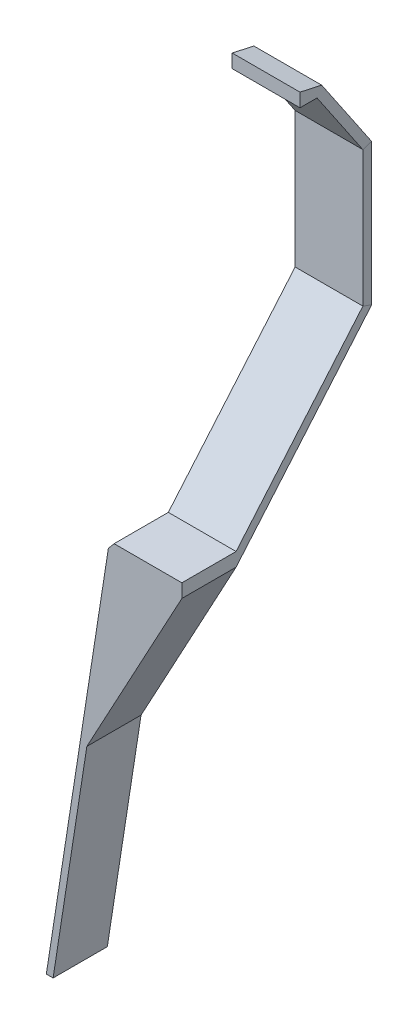
ISO-10303-21;
HEADER;
FILE_DESCRIPTION(('STEP AP214'),'2;1');
FILE_NAME('part.step','',(''),(''),'','','');
FILE_SCHEMA(('AUTOMOTIVE_DESIGN { 1 0 10303 214 1 1 1 1 }'));
ENDSEC;
DATA;
#1=APPLICATION_CONTEXT('core data for automotive mechanical design processes');
#2=APPLICATION_PROTOCOL_DEFINITION('international standard','automotive_design',2000,#1);
#3=PRODUCT_CONTEXT('',#1,'mechanical');
#4=PRODUCT('Part','Part','',(#3));
#5=PRODUCT_RELATED_PRODUCT_CATEGORY('part','',(#4));
#6=PRODUCT_DEFINITION_FORMATION('','',#4);
#7=PRODUCT_DEFINITION_CONTEXT('part definition',#1,'design');
#8=PRODUCT_DEFINITION('design','',#6,#7);
#9=PRODUCT_DEFINITION_SHAPE('','',#8);
#10=(LENGTH_UNIT() NAMED_UNIT(*) SI_UNIT(.MILLI.,.METRE.));
#11=(NAMED_UNIT(*) PLANE_ANGLE_UNIT() SI_UNIT($,.RADIAN.));
#12=(NAMED_UNIT(*) SI_UNIT($,.STERADIAN.) SOLID_ANGLE_UNIT());
#13=UNCERTAINTY_MEASURE_WITH_UNIT(LENGTH_MEASURE(1.E-05),#10,'distance_accuracy_value','');
#14=(GEOMETRIC_REPRESENTATION_CONTEXT(3) GLOBAL_UNCERTAINTY_ASSIGNED_CONTEXT((#13)) GLOBAL_UNIT_ASSIGNED_CONTEXT((#10,
#11,#12)) REPRESENTATION_CONTEXT('',''));
#15=CARTESIAN_POINT('',(0.,0.,0.));
#16=DIRECTION('',(0.,0.,1.));
#17=DIRECTION('',(1.,0.,0.));
#18=AXIS2_PLACEMENT_3D('',#15,#16,#17);
#19=CARTESIAN_POINT('',(0.,0.,0.));
#20=DIRECTION('',(-1.,0.,0.));
#21=DIRECTION('',(0.,0.,1.));
#22=AXIS2_PLACEMENT_3D('',#19,#20,#21);
#23=PLANE('',#22);
#24=DIRECTION('',(0.,1.,0.));
#25=VECTOR('',#24,1.);
#26=CARTESIAN_POINT('',(0.,0.,-16.));
#27=LINE('',#26,#25);
#28=CARTESIAN_POINT('',(0.,232.,-16.));
#29=VERTEX_POINT('',#28);
#30=CARTESIAN_POINT('',(0.,240.,-16.));
#31=VERTEX_POINT('',#30);
#32=EDGE_CURVE('E172',#29,#31,#27,.T.);
#33=ORIENTED_EDGE('',*,*,#32,.T.);
#34=DIRECTION('',(0.,0.761771723284971,-0.647845538383529));
#35=VECTOR('',#34,1.);
#36=CARTESIAN_POINT('',(0.,240.,-16.));
#37=LINE('',#36,#35);
#38=CARTESIAN_POINT('',(0.,328.,-90.8392275994517));
#39=VERTEX_POINT('',#38);
#40=EDGE_CURVE('E261',#31,#39,#37,.T.);
#41=ORIENTED_EDGE('',*,*,#40,.T.);
#42=DIRECTION('',(0.,-0.345129161847437,-0.938555199038653));
#43=VECTOR('',#42,1.);
#44=CARTESIAN_POINT('',(0.,341.760085672726,-53.4196137997259));
#45=LINE('',#44,#43);
#46=CARTESIAN_POINT('',(0.,326.09417378628,-96.02199190652));
#47=VERTEX_POINT('',#46);
#48=EDGE_CURVE('E235',#39,#47,#45,.T.);
#49=ORIENTED_EDGE('',*,*,#48,.T.);
#50=DIRECTION('',(0.,0.761771723284971,-0.647845538383529));
#51=VECTOR('',#50,1.);
#52=CARTESIAN_POINT('',(0.,232.,-16.));
#53=LINE('',#52,#51);
#54=EDGE_CURVE('E248',#29,#47,#53,.T.);
#55=ORIENTED_EDGE('',*,*,#54,.F.);
#56=EDGE_LOOP('',(#33,#41,#49,#55));
#57=FACE_BOUND('',#56,.T.);
#58=ADVANCED_FACE('F39',(#57),#23,.T.);
#59=CARTESIAN_POINT('',(8.,0.,16.));
#60=DIRECTION('',(0.,0.,-1.));
#61=DIRECTION('',(-1.,0.,0.));
#62=AXIS2_PLACEMENT_3D('',#59,#60,#61);
#63=PLANE('',#62);
#64=DIRECTION('',(-0.641737198130796,-0.766924617244248,0.));
#65=VECTOR('',#64,1.);
#66=CARTESIAN_POINT('',(-3.38665068067361,235.952695613437,16.));
#67=LINE('',#66,#65);
#68=CARTESIAN_POINT('',(0.,240.,16.));
#69=VERTEX_POINT('',#68);
#70=CARTESIAN_POINT('',(-3.38665068067361,235.952695613437,16.));
#71=VERTEX_POINT('',#70);
#72=EDGE_CURVE('E168',#69,#71,#67,.T.);
#73=ORIENTED_EDGE('',*,*,#72,.T.);
#74=DIRECTION('',(0.153337329831597,0.988173903359179,0.));
#75=VECTOR('',#74,1.);
#76=CARTESIAN_POINT('',(-40.,0.,16.));
#77=LINE('',#76,#75);
#78=CARTESIAN_POINT('',(-40.,0.,16.));
#79=VERTEX_POINT('',#78);
#80=EDGE_CURVE('E149',#79,#71,#77,.T.);
#81=ORIENTED_EDGE('',*,*,#80,.F.);
#82=DIRECTION('',(-1.,0.,0.));
#83=VECTOR('',#82,1.);
#84=CARTESIAN_POINT('',(-40.,0.,16.));
#85=LINE('',#84,#83);
#86=CARTESIAN_POINT('',(-36.,0.,16.));
#87=VERTEX_POINT('',#86);
#88=EDGE_CURVE('E162',#87,#79,#85,.T.);
#89=ORIENTED_EDGE('',*,*,#88,.F.);
#90=DIRECTION('',(0.153337329831597,0.988173903359179,0.));
#91=VECTOR('',#90,1.);
#92=CARTESIAN_POINT('',(-36.,0.,16.));
#93=LINE('',#92,#91);
#94=CARTESIAN_POINT('',(-16.0848412184879,128.342134369745,16.));
#95=VERTEX_POINT('',#94);
#96=EDGE_CURVE('E173',#87,#95,#93,.T.);
#97=ORIENTED_EDGE('',*,*,#96,.T.);
#98=DIRECTION('',(0.475868701001294,0.87951633265525,0.));
#99=VECTOR('',#98,1.);
#100=CARTESIAN_POINT('',(40.,232.,16.));
#101=LINE('',#100,#99);
#102=CARTESIAN_POINT('',(40.,232.,16.));
#103=VERTEX_POINT('',#102);
#104=EDGE_CURVE('E179',#95,#103,#101,.T.);
#105=ORIENTED_EDGE('',*,*,#104,.T.);
#106=DIRECTION('',(0.,1.,0.));
#107=VECTOR('',#106,1.);
#108=CARTESIAN_POINT('',(40.,240.,16.));
#109=LINE('',#108,#107);
#110=CARTESIAN_POINT('',(40.,240.,16.));
#111=VERTEX_POINT('',#110);
#112=EDGE_CURVE('E234',#103,#111,#109,.T.);
#113=ORIENTED_EDGE('',*,*,#112,.T.);
#114=DIRECTION('',(-1.,0.,0.));
#115=VECTOR('',#114,1.);
#116=CARTESIAN_POINT('',(8.,240.,16.));
#117=LINE('',#116,#115);
#118=EDGE_CURVE('E48',#111,#69,#117,.T.);
#119=ORIENTED_EDGE('',*,*,#118,.T.);
#120=EDGE_LOOP('',(#73,#81,#89,#97,#105,#113,#119));
#121=FACE_BOUND('',#120,.T.);
#122=ADVANCED_FACE('F41',(#121),#63,.F.);
#123=CARTESIAN_POINT('',(8.,240.,16.));
#124=DIRECTION('',(0.,-1.,0.));
#125=DIRECTION('',(0.,0.,-1.));
#126=AXIS2_PLACEMENT_3D('',#123,#124,#125);
#127=PLANE('',#126);
#128=DIRECTION('',(0.,0.,1.));
#129=VECTOR('',#128,1.);
#130=CARTESIAN_POINT('',(0.,240.,16.));
#131=LINE('',#130,#129);
#132=EDGE_CURVE('E340',#31,#69,#131,.T.);
#133=ORIENTED_EDGE('',*,*,#132,.T.);
#134=ORIENTED_EDGE('',*,*,#118,.F.);
#135=DIRECTION('',(0.,0.,1.));
#136=VECTOR('',#135,1.);
#137=CARTESIAN_POINT('',(40.,240.,-16.));
#138=LINE('',#137,#136);
#139=CARTESIAN_POINT('',(40.,240.,-16.));
#140=VERTEX_POINT('',#139);
#141=EDGE_CURVE('E336',#140,#111,#138,.T.);
#142=ORIENTED_EDGE('',*,*,#141,.F.);
#143=DIRECTION('',(-1.,0.,0.));
#144=VECTOR('',#143,1.);
#145=CARTESIAN_POINT('',(8.,240.,-16.));
#146=LINE('',#145,#144);
#147=EDGE_CURVE('E11',#140,#31,#146,.T.);
#148=ORIENTED_EDGE('',*,*,#147,.T.);
#149=EDGE_LOOP('',(#133,#134,#142,#148));
#150=FACE_BOUND('',#149,.T.);
#151=ADVANCED_FACE('F348',(#150),#127,.F.);
#152=CARTESIAN_POINT('',(40.,240.,-16.));
#153=DIRECTION('',(1.,0.,0.));
#154=DIRECTION('',(0.,1.,0.));
#155=AXIS2_PLACEMENT_3D('',#152,#153,#154);
#156=PLANE('',#155);
#157=DIRECTION('',(0.,0.761771723284971,-0.647845538383529));
#158=VECTOR('',#157,1.);
#159=CARTESIAN_POINT('',(40.,240.,-16.));
#160=LINE('',#159,#158);
#161=CARTESIAN_POINT('',(40.,328.,-90.8392275994517));
#162=VERTEX_POINT('',#161);
#163=EDGE_CURVE('E249',#140,#162,#160,.T.);
#164=ORIENTED_EDGE('',*,*,#163,.F.);
#165=ORIENTED_EDGE('',*,*,#141,.T.);
#166=ORIENTED_EDGE('',*,*,#112,.F.);
#167=DIRECTION('',(0.,0.,1.));
#168=VECTOR('',#167,1.);
#169=CARTESIAN_POINT('',(40.,232.,-16.));
#170=LINE('',#169,#168);
#171=CARTESIAN_POINT('',(40.,232.,-16.));
#172=VERTEX_POINT('',#171);
#173=EDGE_CURVE('E335',#172,#103,#170,.T.);
#174=ORIENTED_EDGE('',*,*,#173,.F.);
#175=DIRECTION('',(0.,0.761771723284971,-0.647845538383529));
#176=VECTOR('',#175,1.);
#177=CARTESIAN_POINT('',(40.,232.,-16.));
#178=LINE('',#177,#176);
#179=CARTESIAN_POINT('',(40.,326.09417378628,-96.02199190652));
#180=VERTEX_POINT('',#179);
#181=EDGE_CURVE('E244',#172,#180,#178,.T.);
#182=ORIENTED_EDGE('',*,*,#181,.T.);
#183=DIRECTION('',(0.,0.345129161847437,0.938555199038653));
#184=VECTOR('',#183,1.);
#185=CARTESIAN_POINT('',(40.,341.760085672726,-53.4196137997259));
#186=LINE('',#185,#184);
#187=EDGE_CURVE('E243',#180,#162,#186,.T.);
#188=ORIENTED_EDGE('',*,*,#187,.T.);
#189=EDGE_LOOP('',(#164,#165,#166,#174,#182,#188));
#190=FACE_BOUND('',#189,.T.);
#191=ADVANCED_FACE('F363',(#190),#156,.T.);
#192=CARTESIAN_POINT('',(40.,447.942286340599,-63.7504190779281));
#193=DIRECTION('',(1.,0.,0.));
#194=DIRECTION('',(0.,0.,-1.));
#195=AXIS2_PLACEMENT_3D('',#192,#193,#194);
#196=PLANE('',#195);
#197=DIRECTION('',(0.,0.,1.));
#198=VECTOR('',#197,1.);
#199=CARTESIAN_POINT('',(40.,447.942286340599,-63.7504190779281));
#200=LINE('',#199,#198);
#201=CARTESIAN_POINT('',(40.,447.942286340599,-63.7504190779282));
#202=VERTEX_POINT('',#201);
#203=CARTESIAN_POINT('',(39.9999999999992,447.942286340599,-53.7048476232816));
#204=VERTEX_POINT('',#203);
#205=EDGE_CURVE('E313',#202,#204,#200,.T.);
#206=ORIENTED_EDGE('',*,*,#205,.F.);
#207=DIRECTION('',(0.,0.827619057057131,0.561290206930306));
#208=VECTOR('',#207,1.);
#209=CARTESIAN_POINT('',(40.,408.,-90.8392275994518));
#210=LINE('',#209,#208);
#211=CARTESIAN_POINT('',(40.,408.,-90.8392275994518));
#212=VERTEX_POINT('',#211);
#213=EDGE_CURVE('E307',#212,#202,#210,.T.);
#214=ORIENTED_EDGE('',*,*,#213,.F.);
#215=DIRECTION('',(0.,-0.29358213752106,0.955933851544429));
#216=VECTOR('',#215,1.);
#217=CARTESIAN_POINT('',(40.,401.104762282285,-68.3876193222395));
#218=LINE('',#217,#216);
#219=CARTESIAN_POINT('',(40.,409.591707439881,-96.02199190652));
#220=VERTEX_POINT('',#219);
#221=EDGE_CURVE('E279',#220,#212,#218,.T.);
#222=ORIENTED_EDGE('',*,*,#221,.F.);
#223=DIRECTION('',(0.,0.827619057057131,0.561290206930306));
#224=VECTOR('',#223,1.);
#225=CARTESIAN_POINT('',(40.,405.865380487842,-98.5491821737872));
#226=LINE('',#225,#224);
#227=CARTESIAN_POINT('',(40.,453.125050647668,-66.4977331196902));
#228=VERTEX_POINT('',#227);
#229=EDGE_CURVE('E317',#220,#228,#226,.T.);
#230=ORIENTED_EDGE('',*,*,#229,.T.);
#231=DIRECTION('',(0.,-0.215065724410468,-0.97659957719825));
#232=VECTOR('',#231,1.);
#233=CARTESIAN_POINT('',(39.9999999999991,453.125050647668,-66.4977331196903));
#234=LINE('',#233,#232);
#235=CARTESIAN_POINT('',(39.9999999999991,455.9422863406,-53.7048476232817));
#236=VERTEX_POINT('',#235);
#237=EDGE_CURVE('E216',#236,#228,#234,.T.);
#238=ORIENTED_EDGE('',*,*,#237,.F.);
#239=DIRECTION('',(0.,1.,0.));
#240=VECTOR('',#239,1.);
#241=CARTESIAN_POINT('',(39.9999999999991,455.9422863406,-53.7048476232817));
#242=LINE('',#241,#240);
#243=EDGE_CURVE('E212',#204,#236,#242,.T.);
#244=ORIENTED_EDGE('',*,*,#243,.F.);
#245=EDGE_LOOP('',(#206,#214,#222,#230,#238,#244));
#246=FACE_BOUND('',#245,.T.);
#247=ADVANCED_FACE('F386',(#246),#196,.T.);
#248=CARTESIAN_POINT('',(0.,447.942286340599,-63.7504190779281));
#249=DIRECTION('',(-1.,0.,0.));
#250=DIRECTION('',(0.,-1.,0.));
#251=AXIS2_PLACEMENT_3D('',#248,#249,#250);
#252=PLANE('',#251);
#253=DIRECTION('',(0.,0.,1.));
#254=VECTOR('',#253,1.);
#255=CARTESIAN_POINT('',(0.,447.942286340599,-63.7504190779281));
#256=LINE('',#255,#254);
#257=CARTESIAN_POINT('',(0.,447.942286340599,-63.7504190779282));
#258=VERTEX_POINT('',#257);
#259=CARTESIAN_POINT('',(-8.46762159601389E-13,447.942286340599,-53.7048476232816));
#260=VERTEX_POINT('',#259);
#261=EDGE_CURVE('E326',#258,#260,#256,.T.);
#262=ORIENTED_EDGE('',*,*,#261,.T.);
#263=DIRECTION('',(0.,1.,0.));
#264=VECTOR('',#263,1.);
#265=CARTESIAN_POINT('',(-8.6188486063538E-13,455.9422863406,-53.7048476232817));
#266=LINE('',#265,#264);
#267=CARTESIAN_POINT('',(-8.6188486063538E-13,455.9422863406,-53.7048476232817));
#268=VERTEX_POINT('',#267);
#269=EDGE_CURVE('E211',#260,#268,#266,.T.);
#270=ORIENTED_EDGE('',*,*,#269,.T.);
#271=DIRECTION('',(0.,-0.215065724410468,-0.97659957719825));
#272=VECTOR('',#271,1.);
#273=CARTESIAN_POINT('',(-8.56559333994568E-13,453.125050647668,-66.4977331196903));
#274=LINE('',#273,#272);
#275=CARTESIAN_POINT('',(-8.56559333994568E-13,453.125050647668,-66.4977331196903));
#276=VERTEX_POINT('',#275);
#277=EDGE_CURVE('E217',#268,#276,#274,.T.);
#278=ORIENTED_EDGE('',*,*,#277,.T.);
#279=DIRECTION('',(0.,0.827619057057131,0.561290206930306));
#280=VECTOR('',#279,1.);
#281=CARTESIAN_POINT('',(0.,405.865380487842,-98.5491821737872));
#282=LINE('',#281,#280);
#283=CARTESIAN_POINT('',(0.,409.591707439881,-96.0219919065201));
#284=VERTEX_POINT('',#283);
#285=EDGE_CURVE('E312',#284,#276,#282,.T.);
#286=ORIENTED_EDGE('',*,*,#285,.F.);
#287=DIRECTION('',(0.,0.29358213752106,-0.955933851544429));
#288=VECTOR('',#287,1.);
#289=CARTESIAN_POINT('',(0.,401.104762282285,-68.3876193222395));
#290=LINE('',#289,#288);
#291=CARTESIAN_POINT('',(0.,408.,-90.8392275994518));
#292=VERTEX_POINT('',#291);
#293=EDGE_CURVE('E271',#292,#284,#290,.T.);
#294=ORIENTED_EDGE('',*,*,#293,.F.);
#295=DIRECTION('',(0.,0.827619057057131,0.561290206930306));
#296=VECTOR('',#295,1.);
#297=CARTESIAN_POINT('',(0.,408.,-90.8392275994518));
#298=LINE('',#297,#296);
#299=EDGE_CURVE('E308',#292,#258,#298,.T.);
#300=ORIENTED_EDGE('',*,*,#299,.T.);
#301=EDGE_LOOP('',(#262,#270,#278,#286,#294,#300));
#302=FACE_BOUND('',#301,.T.);
#303=ADVANCED_FACE('F395',(#302),#252,.T.);
#304=CARTESIAN_POINT('',(40.,447.942286340599,-63.7504190779281));
#305=DIRECTION('',(0.,-1.,0.));
#306=DIRECTION('',(0.,0.,-1.));
#307=AXIS2_PLACEMENT_3D('',#304,#305,#306);
#308=PLANE('',#307);
#309=DIRECTION('',(1.,0.,0.));
#310=VECTOR('',#309,1.);
#311=CARTESIAN_POINT('',(40.,447.942286340599,-53.7048476232816));
#312=LINE('',#311,#310);
#313=EDGE_CURVE('E229',#260,#204,#312,.T.);
#314=ORIENTED_EDGE('',*,*,#313,.F.);
#315=ORIENTED_EDGE('',*,*,#261,.F.);
#316=DIRECTION('',(-1.,0.,0.));
#317=VECTOR('',#316,1.);
#318=CARTESIAN_POINT('',(40.,447.942286340599,-63.7504190779282));
#319=LINE('',#318,#317);
#320=EDGE_CURVE('E303',#202,#258,#319,.T.);
#321=ORIENTED_EDGE('',*,*,#320,.F.);
#322=ORIENTED_EDGE('',*,*,#205,.T.);
#323=EDGE_LOOP('',(#314,#315,#321,#322));
#324=FACE_BOUND('',#323,.T.);
#325=ADVANCED_FACE('F401',(#324),#308,.T.);
#326=CARTESIAN_POINT('',(40.,408.,-90.8392275994518));
#327=DIRECTION('',(0.,-0.561290206930306,0.827619057057131));
#328=DIRECTION('',(0.,-0.827619057057131,-0.561290206930306));
#329=AXIS2_PLACEMENT_3D('',#326,#327,#328);
#330=PLANE('',#329);
#331=ORIENTED_EDGE('',*,*,#213,.T.);
#332=ORIENTED_EDGE('',*,*,#320,.T.);
#333=ORIENTED_EDGE('',*,*,#299,.F.);
#334=DIRECTION('',(-1.,0.,0.));
#335=VECTOR('',#334,1.);
#336=CARTESIAN_POINT('',(40.,408.,-90.8392275994518));
#337=LINE('',#336,#335);
#338=EDGE_CURVE('E275',#212,#292,#337,.T.);
#339=ORIENTED_EDGE('',*,*,#338,.F.);
#340=EDGE_LOOP('',(#331,#332,#333,#339));
#341=FACE_BOUND('',#340,.T.);
#342=ADVANCED_FACE('F403',(#341),#330,.T.);
#343=CARTESIAN_POINT('',(40.,405.865380487842,-98.5491821737872));
#344=DIRECTION('',(0.,0.561290206930306,-0.827619057057131));
#345=DIRECTION('',(0.,0.827619057057131,0.561290206930306));
#346=AXIS2_PLACEMENT_3D('',#343,#344,#345);
#347=PLANE('',#346);
#348=ORIENTED_EDGE('',*,*,#285,.T.);
#349=DIRECTION('',(1.,0.,0.));
#350=VECTOR('',#349,1.);
#351=CARTESIAN_POINT('',(40.,453.125050647668,-66.4977331196903));
#352=LINE('',#351,#350);
#353=EDGE_CURVE('E285',#276,#228,#352,.T.);
#354=ORIENTED_EDGE('',*,*,#353,.T.);
#355=ORIENTED_EDGE('',*,*,#229,.F.);
#356=DIRECTION('',(1.,0.,0.));
#357=VECTOR('',#356,1.);
#358=CARTESIAN_POINT('',(40.,409.591707439881,-96.02199190652));
#359=LINE('',#358,#357);
#360=EDGE_CURVE('E257',#284,#220,#359,.T.);
#361=ORIENTED_EDGE('',*,*,#360,.F.);
#362=EDGE_LOOP('',(#348,#354,#355,#361));
#363=FACE_BOUND('',#362,.T.);
#364=ADVANCED_FACE('F389',(#363),#347,.T.);
#365=CARTESIAN_POINT('',(40.,328.,-90.8392275994518));
#366=DIRECTION('',(0.,0.,1.));
#367=DIRECTION('',(1.,0.,0.));
#368=AXIS2_PLACEMENT_3D('',#365,#366,#367);
#369=PLANE('',#368);
#370=DIRECTION('',(0.,1.,0.));
#371=VECTOR('',#370,1.);
#372=CARTESIAN_POINT('',(40.,328.,-90.8392275994518));
#373=LINE('',#372,#371);
#374=EDGE_CURVE('E286',#162,#212,#373,.T.);
#375=ORIENTED_EDGE('',*,*,#374,.T.);
#376=ORIENTED_EDGE('',*,*,#338,.T.);
#377=DIRECTION('',(0.,1.,0.));
#378=VECTOR('',#377,1.);
#379=CARTESIAN_POINT('',(0.,328.,-90.8392275994518));
#380=LINE('',#379,#378);
#381=EDGE_CURVE('E280',#39,#292,#380,.T.);
#382=ORIENTED_EDGE('',*,*,#381,.F.);
#383=DIRECTION('',(-1.,0.,0.));
#384=VECTOR('',#383,1.);
#385=CARTESIAN_POINT('',(40.,328.,-90.8392275994517));
#386=LINE('',#385,#384);
#387=EDGE_CURVE('E239',#162,#39,#386,.T.);
#388=ORIENTED_EDGE('',*,*,#387,.F.);
#389=EDGE_LOOP('',(#375,#376,#382,#388));
#390=FACE_BOUND('',#389,.T.);
#391=ADVANCED_FACE('F379',(#390),#369,.T.);
#392=CARTESIAN_POINT('',(0.,328.,-90.8392275994518));
#393=DIRECTION('',(-1.,0.,0.));
#394=DIRECTION('',(0.,0.,1.));
#395=AXIS2_PLACEMENT_3D('',#392,#393,#394);
#396=PLANE('',#395);
#397=ORIENTED_EDGE('',*,*,#381,.T.);
#398=ORIENTED_EDGE('',*,*,#293,.T.);
#399=DIRECTION('',(0.,1.,0.));
#400=VECTOR('',#399,1.);
#401=CARTESIAN_POINT('',(0.,321.90582621372,-96.02199190652));
#402=LINE('',#401,#400);
#403=EDGE_CURVE('E284',#47,#284,#402,.T.);
#404=ORIENTED_EDGE('',*,*,#403,.F.);
#405=ORIENTED_EDGE('',*,*,#48,.F.);
#406=EDGE_LOOP('',(#397,#398,#404,#405));
#407=FACE_BOUND('',#406,.T.);
#408=ADVANCED_FACE('F372',(#407),#396,.T.);
#409=CARTESIAN_POINT('',(40.,321.90582621372,-96.02199190652));
#410=DIRECTION('',(0.,0.,-1.));
#411=DIRECTION('',(-1.,0.,0.));
#412=AXIS2_PLACEMENT_3D('',#409,#410,#411);
#413=PLANE('',#412);
#414=ORIENTED_EDGE('',*,*,#403,.T.);
#415=ORIENTED_EDGE('',*,*,#360,.T.);
#416=DIRECTION('',(0.,1.,0.));
#417=VECTOR('',#416,1.);
#418=CARTESIAN_POINT('',(40.,321.90582621372,-96.02199190652));
#419=LINE('',#418,#417);
#420=EDGE_CURVE('E290',#180,#220,#419,.T.);
#421=ORIENTED_EDGE('',*,*,#420,.F.);
#422=DIRECTION('',(1.,0.,0.));
#423=VECTOR('',#422,1.);
#424=CARTESIAN_POINT('',(40.,326.09417378628,-96.02199190652));
#425=LINE('',#424,#423);
#426=EDGE_CURVE('E230',#47,#180,#425,.T.);
#427=ORIENTED_EDGE('',*,*,#426,.F.);
#428=EDGE_LOOP('',(#414,#415,#421,#427));
#429=FACE_BOUND('',#428,.T.);
#430=ADVANCED_FACE('F370',(#429),#413,.T.);
#431=CARTESIAN_POINT('',(40.,328.,-90.8392275994518));
#432=DIRECTION('',(1.,0.,0.));
#433=DIRECTION('',(0.,0.,-1.));
#434=AXIS2_PLACEMENT_3D('',#431,#432,#433);
#435=PLANE('',#434);
#436=ORIENTED_EDGE('',*,*,#420,.T.);
#437=ORIENTED_EDGE('',*,*,#221,.T.);
#438=ORIENTED_EDGE('',*,*,#374,.F.);
#439=ORIENTED_EDGE('',*,*,#187,.F.);
#440=EDGE_LOOP('',(#436,#437,#438,#439));
#441=FACE_BOUND('',#440,.T.);
#442=ADVANCED_FACE('F381',(#441),#435,.T.);
#443=CARTESIAN_POINT('',(40.,240.,-16.));
#444=DIRECTION('',(0.,0.647845538383529,0.761771723284972));
#445=DIRECTION('',(0.,-0.761771723284972,0.647845538383529));
#446=AXIS2_PLACEMENT_3D('',#443,#444,#445);
#447=PLANE('',#446);
#448=ORIENTED_EDGE('',*,*,#163,.T.);
#449=ORIENTED_EDGE('',*,*,#387,.T.);
#450=ORIENTED_EDGE('',*,*,#40,.F.);
#451=ORIENTED_EDGE('',*,*,#147,.F.);
#452=EDGE_LOOP('',(#448,#449,#450,#451));
#453=FACE_BOUND('',#452,.T.);
#454=ADVANCED_FACE('F376',(#453),#447,.T.);
#455=CARTESIAN_POINT('',(40.,232.,-16.));
#456=DIRECTION('',(0.,-0.647845538383529,-0.761771723284972));
#457=DIRECTION('',(0.,0.761771723284972,-0.647845538383529));
#458=AXIS2_PLACEMENT_3D('',#455,#456,#457);
#459=PLANE('',#458);
#460=ORIENTED_EDGE('',*,*,#54,.T.);
#461=ORIENTED_EDGE('',*,*,#426,.T.);
#462=ORIENTED_EDGE('',*,*,#181,.F.);
#463=DIRECTION('',(-1.,0.,0.));
#464=VECTOR('',#463,1.);
#465=CARTESIAN_POINT('',(40.,232.,-16.));
#466=LINE('',#465,#464);
#467=EDGE_CURVE('E253',#172,#29,#466,.T.);
#468=ORIENTED_EDGE('',*,*,#467,.T.);
#469=EDGE_LOOP('',(#460,#461,#462,#468));
#470=FACE_BOUND('',#469,.T.);
#471=ADVANCED_FACE('F365',(#470),#459,.T.);
#472=CARTESIAN_POINT('',(39.9999999999991,453.125050647668,-66.4977331196903));
#473=DIRECTION('',(0.,0.97659957719825,-0.215065724410468));
#474=DIRECTION('',(0.,0.215065724410468,0.97659957719825));
#475=AXIS2_PLACEMENT_3D('',#472,#473,#474);
#476=PLANE('',#475);
#477=ORIENTED_EDGE('',*,*,#277,.F.);
#478=DIRECTION('',(-1.,0.,0.));
#479=VECTOR('',#478,1.);
#480=CARTESIAN_POINT('',(39.9999999999991,455.9422863406,-53.7048476232817));
#481=LINE('',#480,#479);
#482=EDGE_CURVE('E220',#236,#268,#481,.T.);
#483=ORIENTED_EDGE('',*,*,#482,.F.);
#484=ORIENTED_EDGE('',*,*,#237,.T.);
#485=ORIENTED_EDGE('',*,*,#353,.F.);
#486=EDGE_LOOP('',(#477,#483,#484,#485));
#487=FACE_BOUND('',#486,.T.);
#488=ADVANCED_FACE('F393',(#487),#476,.T.);
#489=CARTESIAN_POINT('',(39.9999999999991,455.9422863406,-53.7048476232817));
#490=DIRECTION('',(0.,0.,1.));
#491=DIRECTION('',(0.,-1.,0.));
#492=AXIS2_PLACEMENT_3D('',#489,#490,#491);
#493=PLANE('',#492);
#494=ORIENTED_EDGE('',*,*,#269,.F.);
#495=ORIENTED_EDGE('',*,*,#313,.T.);
#496=ORIENTED_EDGE('',*,*,#243,.T.);
#497=ORIENTED_EDGE('',*,*,#482,.T.);
#498=EDGE_LOOP('',(#494,#495,#496,#497));
#499=FACE_BOUND('',#498,.T.);
#500=ADVANCED_FACE('F398',(#499),#493,.T.);
#501=CARTESIAN_POINT('',(0.,0.,0.));
#502=DIRECTION('',(0.,-1.,0.));
#503=DIRECTION('',(0.,0.,-1.));
#504=AXIS2_PLACEMENT_3D('',#501,#502,#503);
#505=PLANE('',#504);
#506=DIRECTION('',(0.,0.,-1.));
#507=VECTOR('',#506,1.);
#508=CARTESIAN_POINT('',(-40.,0.,16.));
#509=LINE('',#508,#507);
#510=CARTESIAN_POINT('',(-40.,0.,-16.));
#511=VERTEX_POINT('',#510);
#512=EDGE_CURVE('E156',#79,#511,#509,.T.);
#513=ORIENTED_EDGE('',*,*,#512,.T.);
#514=DIRECTION('',(1.,0.,0.));
#515=VECTOR('',#514,1.);
#516=CARTESIAN_POINT('',(-40.,0.,-16.));
#517=LINE('',#516,#515);
#518=CARTESIAN_POINT('',(-36.,0.,-16.));
#519=VERTEX_POINT('',#518);
#520=EDGE_CURVE('E193',#511,#519,#517,.T.);
#521=ORIENTED_EDGE('',*,*,#520,.T.);
#522=DIRECTION('',(0.,0.,1.));
#523=VECTOR('',#522,1.);
#524=CARTESIAN_POINT('',(-36.,0.,16.));
#525=LINE('',#524,#523);
#526=EDGE_CURVE('E199',#519,#87,#525,.T.);
#527=ORIENTED_EDGE('',*,*,#526,.T.);
#528=ORIENTED_EDGE('',*,*,#88,.T.);
#529=EDGE_LOOP('',(#513,#521,#527,#528));
#530=FACE_BOUND('',#529,.T.);
#531=ADVANCED_FACE('F356',(#530),#505,.T.);
#532=CARTESIAN_POINT('',(-3.76398081680834,235.952695613437,-16.));
#533=DIRECTION('',(0.,0.,1.));
#534=DIRECTION('',(1.,0.,0.));
#535=AXIS2_PLACEMENT_3D('',#532,#533,#534);
#536=PLANE('',#535);
#537=ORIENTED_EDGE('',*,*,#32,.F.);
#538=ORIENTED_EDGE('',*,*,#467,.F.);
#539=DIRECTION('',(0.475868701001294,0.87951633265525,0.));
#540=VECTOR('',#539,1.);
#541=CARTESIAN_POINT('',(40.,232.,-16.));
#542=LINE('',#541,#540);
#543=CARTESIAN_POINT('',(-16.084841218488,128.342134369744,-16.));
#544=VERTEX_POINT('',#543);
#545=EDGE_CURVE('E178',#544,#172,#542,.T.);
#546=ORIENTED_EDGE('',*,*,#545,.F.);
#547=DIRECTION('',(0.153337329831597,0.988173903359179,0.));
#548=VECTOR('',#547,1.);
#549=CARTESIAN_POINT('',(-36.,0.,-16.));
#550=LINE('',#549,#548);
#551=EDGE_CURVE('E60',#519,#544,#550,.T.);
#552=ORIENTED_EDGE('',*,*,#551,.F.);
#553=ORIENTED_EDGE('',*,*,#520,.F.);
#554=DIRECTION('',(0.153337329831597,0.988173903359179,0.));
#555=VECTOR('',#554,1.);
#556=CARTESIAN_POINT('',(-40.,0.,-16.));
#557=LINE('',#556,#555);
#558=CARTESIAN_POINT('',(-3.38665068067361,235.952695613437,-16.));
#559=VERTEX_POINT('',#558);
#560=EDGE_CURVE('E161',#511,#559,#557,.T.);
#561=ORIENTED_EDGE('',*,*,#560,.T.);
#562=DIRECTION('',(-0.641737198130796,-0.766924617244248,0.));
#563=VECTOR('',#562,1.);
#564=CARTESIAN_POINT('',(-3.38665068067361,235.952695613437,-16.));
#565=LINE('',#564,#563);
#566=EDGE_CURVE('E170',#31,#559,#565,.T.);
#567=ORIENTED_EDGE('',*,*,#566,.F.);
#568=EDGE_LOOP('',(#537,#538,#546,#552,#553,#561,#567));
#569=FACE_BOUND('',#568,.T.);
#570=ADVANCED_FACE('F352',(#569),#536,.F.);
#571=CARTESIAN_POINT('',(-36.,0.,16.));
#572=DIRECTION('',(-0.988173903359179,0.153337329831597,0.));
#573=DIRECTION('',(-0.153337329831597,-0.988173903359179,0.));
#574=AXIS2_PLACEMENT_3D('',#571,#572,#573);
#575=PLANE('',#574);
#576=ORIENTED_EDGE('',*,*,#551,.T.);
#577=DIRECTION('',(0.,0.,1.));
#578=VECTOR('',#577,1.);
#579=CARTESIAN_POINT('',(-16.084841218488,128.342134369744,16.0000000000001));
#580=LINE('',#579,#578);
#581=EDGE_CURVE('E55',#544,#95,#580,.T.);
#582=ORIENTED_EDGE('',*,*,#581,.T.);
#583=ORIENTED_EDGE('',*,*,#96,.F.);
#584=ORIENTED_EDGE('',*,*,#526,.F.);
#585=EDGE_LOOP('',(#576,#582,#583,#584));
#586=FACE_BOUND('',#585,.T.);
#587=ADVANCED_FACE('F478',(#586),#575,.F.);
#588=CARTESIAN_POINT('',(-40.,0.,16.));
#589=DIRECTION('',(0.988173903359179,-0.153337329831597,0.));
#590=DIRECTION('',(0.153337329831597,0.988173903359179,0.));
#591=AXIS2_PLACEMENT_3D('',#588,#589,#590);
#592=PLANE('',#591);
#593=ORIENTED_EDGE('',*,*,#80,.T.);
#594=DIRECTION('',(0.,0.,1.));
#595=VECTOR('',#594,1.);
#596=CARTESIAN_POINT('',(-3.38665068067362,235.952695613437,16.));
#597=LINE('',#596,#595);
#598=EDGE_CURVE('E153',#559,#71,#597,.T.);
#599=ORIENTED_EDGE('',*,*,#598,.F.);
#600=ORIENTED_EDGE('',*,*,#560,.F.);
#601=ORIENTED_EDGE('',*,*,#512,.F.);
#602=EDGE_LOOP('',(#593,#599,#600,#601));
#603=FACE_BOUND('',#602,.T.);
#604=ADVANCED_FACE('F151',(#603),#592,.F.);
#605=CARTESIAN_POINT('',(40.,232.,-16.));
#606=DIRECTION('',(0.87951633265525,-0.475868701001294,0.));
#607=DIRECTION('',(0.475868701001294,0.87951633265525,0.));
#608=AXIS2_PLACEMENT_3D('',#605,#606,#607);
#609=PLANE('',#608);
#610=ORIENTED_EDGE('',*,*,#581,.F.);
#611=ORIENTED_EDGE('',*,*,#545,.T.);
#612=ORIENTED_EDGE('',*,*,#173,.T.);
#613=ORIENTED_EDGE('',*,*,#104,.F.);
#614=EDGE_LOOP('',(#610,#611,#612,#613));
#615=FACE_BOUND('',#614,.T.);
#616=ADVANCED_FACE('F359',(#615),#609,.T.);
#617=CARTESIAN_POINT('',(-3.38665068067361,235.952695613437,-16.));
#618=DIRECTION('',(-0.766924617244248,0.641737198130796,0.));
#619=DIRECTION('',(-0.641737198130796,-0.766924617244248,0.));
#620=AXIS2_PLACEMENT_3D('',#617,#618,#619);
#621=PLANE('',#620);
#622=ORIENTED_EDGE('',*,*,#72,.F.);
#623=ORIENTED_EDGE('',*,*,#132,.F.);
#624=ORIENTED_EDGE('',*,*,#566,.T.);
#625=ORIENTED_EDGE('',*,*,#598,.T.);
#626=EDGE_LOOP('',(#622,#623,#624,#625));
#627=FACE_BOUND('',#626,.T.);
#628=ADVANCED_FACE('F166',(#627),#621,.T.);
#629=CLOSED_SHELL('',(#58,#122,#151,#191,#247,#303,#325,#342,#364,#391,#408,#430,#442,#454,#471,
#488,#500,#531,#570,#587,#604,#616,#628));
#630=MANIFOLD_SOLID_BREP('B2',#629);
#631=ADVANCED_BREP_SHAPE_REPRESENTATION('',(#18,#630),#14);
#632=SHAPE_DEFINITION_REPRESENTATION(#9,#631);
ENDSEC;
END-ISO-10303-21;
